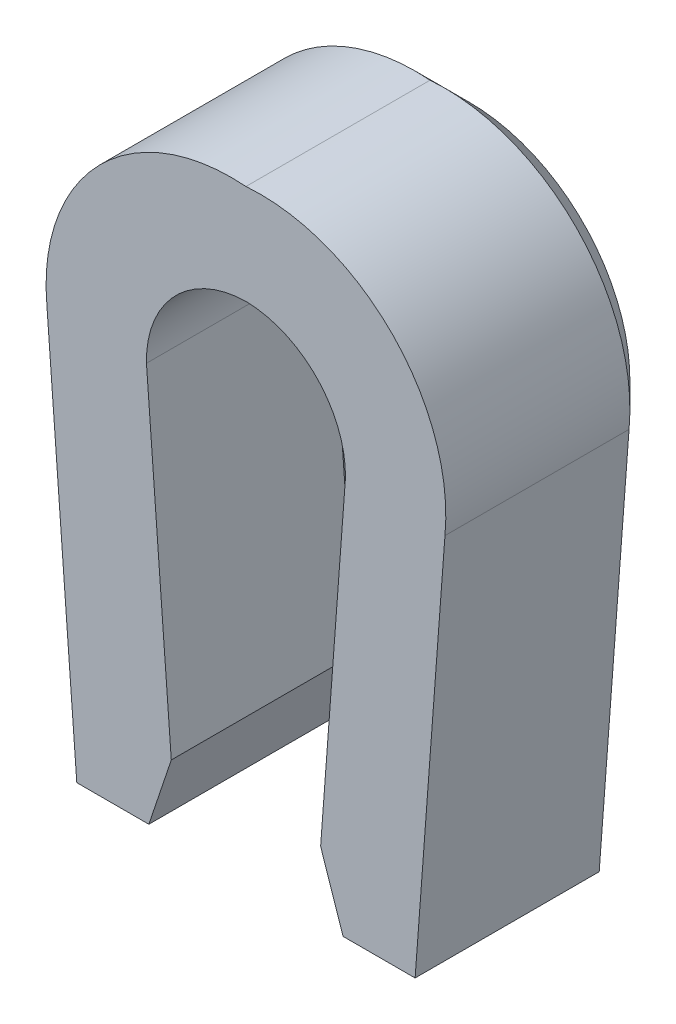
ISO-10303-21;
HEADER;
FILE_DESCRIPTION(('STEP AP214'),'2;1');
FILE_NAME('part.step','',(''),(''),'','','');
FILE_SCHEMA(('AUTOMOTIVE_DESIGN { 1 0 10303 214 1 1 1 1 }'));
ENDSEC;
DATA;
#1=APPLICATION_CONTEXT('core data for automotive mechanical design processes');
#2=APPLICATION_PROTOCOL_DEFINITION('international standard','automotive_design',2000,#1);
#3=PRODUCT_CONTEXT('',#1,'mechanical');
#4=PRODUCT('Part','Part','',(#3));
#5=PRODUCT_RELATED_PRODUCT_CATEGORY('part','',(#4));
#6=PRODUCT_DEFINITION_FORMATION('','',#4);
#7=PRODUCT_DEFINITION_CONTEXT('part definition',#1,'design');
#8=PRODUCT_DEFINITION('design','',#6,#7);
#9=PRODUCT_DEFINITION_SHAPE('','',#8);
#10=(LENGTH_UNIT() NAMED_UNIT(*) SI_UNIT(.MILLI.,.METRE.));
#11=(NAMED_UNIT(*) PLANE_ANGLE_UNIT() SI_UNIT($,.RADIAN.));
#12=(NAMED_UNIT(*) SI_UNIT($,.STERADIAN.) SOLID_ANGLE_UNIT());
#13=UNCERTAINTY_MEASURE_WITH_UNIT(LENGTH_MEASURE(1.E-05),#10,'distance_accuracy_value','');
#14=(GEOMETRIC_REPRESENTATION_CONTEXT(3) GLOBAL_UNCERTAINTY_ASSIGNED_CONTEXT((#13)) GLOBAL_UNIT_ASSIGNED_CONTEXT((#10,
#11,#12)) REPRESENTATION_CONTEXT('',''));
#15=CARTESIAN_POINT('',(0.,0.,0.));
#16=DIRECTION('',(0.,0.,1.));
#17=DIRECTION('',(1.,0.,0.));
#18=AXIS2_PLACEMENT_3D('',#15,#16,#17);
#19=CARTESIAN_POINT('',(2.,4.,4.2));
#20=DIRECTION('',(0.997199309888457,-0.0747899482416341,0.));
#21=DIRECTION('',(0.0747899482416341,0.997199309888457,0.));
#22=AXIS2_PLACEMENT_3D('',#19,#20,#21);
#23=PLANE('',#22);
#24=DIRECTION('',(0.,0.,-1.));
#25=VECTOR('',#24,1.);
#26=CARTESIAN_POINT('',(2.,4.,4.2));
#27=LINE('',#26,#25);
#28=CARTESIAN_POINT('',(2.,4.,4.2));
#29=VERTEX_POINT('',#28);
#30=CARTESIAN_POINT('',(2.,4.,0.5));
#31=VERTEX_POINT('',#30);
#32=EDGE_CURVE('E210',#29,#31,#27,.T.);
#33=ORIENTED_EDGE('',*,*,#32,.T.);
#34=DIRECTION('',(-0.0747899482416341,-0.997199309888457,0.));
#35=VECTOR('',#34,1.);
#36=CARTESIAN_POINT('',(1.50084079562383,-2.65545605834899,0.500000000000001));
#37=LINE('',#36,#35);
#38=CARTESIAN_POINT('',(1.50084079562383,-2.65545605834898,0.5));
#39=VERTEX_POINT('',#38);
#40=EDGE_CURVE('E246',#31,#39,#37,.T.);
#41=ORIENTED_EDGE('',*,*,#40,.T.);
#42=DIRECTION('',(0.,0.,-1.));
#43=VECTOR('',#42,1.);
#44=CARTESIAN_POINT('',(1.50084079562383,-2.65545605834898,4.2));
#45=LINE('',#44,#43);
#46=CARTESIAN_POINT('',(1.50084079562383,-2.65545605834898,4.2));
#47=VERTEX_POINT('',#46);
#48=EDGE_CURVE('E486',#47,#39,#45,.T.);
#49=ORIENTED_EDGE('',*,*,#48,.F.);
#50=DIRECTION('',(-0.0747899482416341,-0.997199309888457,0.));
#51=VECTOR('',#50,1.);
#52=CARTESIAN_POINT('',(2.,4.,4.2));
#53=LINE('',#52,#51);
#54=EDGE_CURVE('E420',#29,#47,#53,.T.);
#55=ORIENTED_EDGE('',*,*,#54,.F.);
#56=EDGE_LOOP('',(#33,#41,#49,#55));
#57=FACE_BOUND('',#56,.T.);
#58=ADVANCED_FACE('F35',(#57),#23,.F.);
#59=CARTESIAN_POINT('',(1.4,-4.,4.2));
#60=DIRECTION('',(0.,1.,0.));
#61=DIRECTION('',(-1.,0.,0.));
#62=AXIS2_PLACEMENT_3D('',#59,#60,#61);
#63=PLANE('',#62);
#64=DIRECTION('',(0.,0.,-1.));
#65=VECTOR('',#64,1.);
#66=CARTESIAN_POINT('',(1.95142804931305,-4.,4.2));
#67=LINE('',#66,#65);
#68=CARTESIAN_POINT('',(1.95142804931305,-4.,4.2));
#69=VERTEX_POINT('',#68);
#70=CARTESIAN_POINT('',(1.95142804931305,-4.,0.5));
#71=VERTEX_POINT('',#70);
#72=EDGE_CURVE('E184',#69,#71,#67,.T.);
#73=ORIENTED_EDGE('',*,*,#72,.T.);
#74=DIRECTION('',(1.,0.,0.));
#75=VECTOR('',#74,1.);
#76=CARTESIAN_POINT('',(3.4,-4.,0.5));
#77=LINE('',#76,#75);
#78=CARTESIAN_POINT('',(3.4,-4.,0.5));
#79=VERTEX_POINT('',#78);
#80=EDGE_CURVE('E250',#71,#79,#77,.T.);
#81=ORIENTED_EDGE('',*,*,#80,.T.);
#82=DIRECTION('',(0.,0.,-1.));
#83=VECTOR('',#82,1.);
#84=CARTESIAN_POINT('',(3.4,-4.,4.2));
#85=LINE('',#84,#83);
#86=CARTESIAN_POINT('',(3.4,-4.,4.2));
#87=VERTEX_POINT('',#86);
#88=EDGE_CURVE('E207',#87,#79,#85,.T.);
#89=ORIENTED_EDGE('',*,*,#88,.F.);
#90=DIRECTION('',(1.,0.,0.));
#91=VECTOR('',#90,1.);
#92=CARTESIAN_POINT('',(1.4,-4.,4.2));
#93=LINE('',#92,#91);
#94=EDGE_CURVE('E478',#69,#87,#93,.T.);
#95=ORIENTED_EDGE('',*,*,#94,.F.);
#96=EDGE_LOOP('',(#73,#81,#89,#95));
#97=FACE_BOUND('',#96,.T.);
#98=ADVANCED_FACE('F377',(#97),#63,.F.);
#99=CARTESIAN_POINT('',(-1.4,-4.,4.2));
#100=DIRECTION('',(0.,1.,0.));
#101=DIRECTION('',(-1.,0.,0.));
#102=AXIS2_PLACEMENT_3D('',#99,#100,#101);
#103=PLANE('',#102);
#104=DIRECTION('',(0.,0.,-1.));
#105=VECTOR('',#104,1.);
#106=CARTESIAN_POINT('',(-3.4,-4.,4.2));
#107=LINE('',#106,#105);
#108=CARTESIAN_POINT('',(-3.4,-4.,4.2));
#109=VERTEX_POINT('',#108);
#110=CARTESIAN_POINT('',(-3.4,-4.,0.5));
#111=VERTEX_POINT('',#110);
#112=EDGE_CURVE('E191',#109,#111,#107,.T.);
#113=ORIENTED_EDGE('',*,*,#112,.T.);
#114=DIRECTION('',(1.,0.,0.));
#115=VECTOR('',#114,1.);
#116=CARTESIAN_POINT('',(-1.95142804931304,-4.,0.5));
#117=LINE('',#116,#115);
#118=CARTESIAN_POINT('',(-1.95142804931304,-4.,0.5));
#119=VERTEX_POINT('',#118);
#120=EDGE_CURVE('E66',#111,#119,#117,.T.);
#121=ORIENTED_EDGE('',*,*,#120,.T.);
#122=DIRECTION('',(0.,0.,-1.));
#123=VECTOR('',#122,1.);
#124=CARTESIAN_POINT('',(-1.95142804931304,-4.,4.2));
#125=LINE('',#124,#123);
#126=CARTESIAN_POINT('',(-1.95142804931304,-4.,4.2));
#127=VERTEX_POINT('',#126);
#128=EDGE_CURVE('E174',#127,#119,#125,.T.);
#129=ORIENTED_EDGE('',*,*,#128,.F.);
#130=DIRECTION('',(1.,0.,0.));
#131=VECTOR('',#130,1.);
#132=CARTESIAN_POINT('',(-1.4,-4.,4.2));
#133=LINE('',#132,#131);
#134=EDGE_CURVE('E183',#109,#127,#133,.T.);
#135=ORIENTED_EDGE('',*,*,#134,.F.);
#136=EDGE_LOOP('',(#113,#121,#129,#135));
#137=FACE_BOUND('',#136,.T.);
#138=ADVANCED_FACE('F383',(#137),#103,.F.);
#139=CARTESIAN_POINT('',(-2.,4.,4.2));
#140=DIRECTION('',(-0.997199309888457,-0.0747899482416344,0.));
#141=DIRECTION('',(0.0747899482416344,-0.997199309888457,0.));
#142=AXIS2_PLACEMENT_3D('',#139,#140,#141);
#143=PLANE('',#142);
#144=DIRECTION('',(0.,0.,-1.));
#145=VECTOR('',#144,1.);
#146=CARTESIAN_POINT('',(-1.50084079562383,-2.65545605834898,4.2));
#147=LINE('',#146,#145);
#148=CARTESIAN_POINT('',(-1.50084079562383,-2.65545605834898,4.2));
#149=VERTEX_POINT('',#148);
#150=CARTESIAN_POINT('',(-1.50084079562383,-2.65545605834898,0.5));
#151=VERTEX_POINT('',#150);
#152=EDGE_CURVE('E166',#149,#151,#147,.T.);
#153=ORIENTED_EDGE('',*,*,#152,.T.);
#154=DIRECTION('',(-0.0747899482416344,0.997199309888457,0.));
#155=VECTOR('',#154,1.);
#156=CARTESIAN_POINT('',(-2.,4.,0.5));
#157=LINE('',#156,#155);
#158=CARTESIAN_POINT('',(-2.,4.,0.5));
#159=VERTEX_POINT('',#158);
#160=EDGE_CURVE('E11',#151,#159,#157,.T.);
#161=ORIENTED_EDGE('',*,*,#160,.T.);
#162=DIRECTION('',(0.,0.,-1.));
#163=VECTOR('',#162,1.);
#164=CARTESIAN_POINT('',(-2.,4.,4.2));
#165=LINE('',#164,#163);
#166=CARTESIAN_POINT('',(-2.,4.,4.2));
#167=VERTEX_POINT('',#166);
#168=EDGE_CURVE('E188',#167,#159,#165,.T.);
#169=ORIENTED_EDGE('',*,*,#168,.F.);
#170=DIRECTION('',(-0.0747899482416344,0.997199309888457,0.));
#171=VECTOR('',#170,1.);
#172=CARTESIAN_POINT('',(-2.,4.,4.2));
#173=LINE('',#172,#171);
#174=EDGE_CURVE('E180',#149,#167,#173,.T.);
#175=ORIENTED_EDGE('',*,*,#174,.F.);
#176=EDGE_LOOP('',(#153,#161,#169,#175));
#177=FACE_BOUND('',#176,.T.);
#178=ADVANCED_FACE('F186',(#177),#143,.F.);
#179=CARTESIAN_POINT('',(0.0360134835005064,4.04110421672633,4.2));
#180=DIRECTION('',(0.,0.,-1.));
#181=DIRECTION('',(-1.,0.,0.));
#182=AXIS2_PLACEMENT_3D('',#179,#180,#181);
#183=PLANE('',#182);
#184=DIRECTION('',(-0.317754359343613,-0.948173068125292,0.));
#185=VECTOR('',#184,1.);
#186=CARTESIAN_POINT('',(-1.95142804931304,-4.,4.2));
#187=LINE('',#186,#185);
#188=EDGE_CURVE('E169',#149,#127,#187,.T.);
#189=ORIENTED_EDGE('',*,*,#188,.F.);
#190=ORIENTED_EDGE('',*,*,#174,.T.);
#191=CARTESIAN_POINT('',(0.0360134835005064,4.04110421672633,4.2));
#192=DIRECTION('',(0.,0.,-1.));
#193=DIRECTION('',(-1.,0.,0.));
#194=AXIS2_PLACEMENT_3D('',#191,#192,#193);
#195=CIRCLE('',#194,2.03642835907099);
#196=CARTESIAN_POINT('',(0.,6.07721410831733,4.2));
#197=VERTEX_POINT('',#196);
#198=EDGE_CURVE('E173',#167,#197,#195,.T.);
#199=ORIENTED_EDGE('',*,*,#198,.T.);
#200=CARTESIAN_POINT('',(-0.0360134835005055,4.04110421672633,4.2));
#201=DIRECTION('',(0.,0.,-1.));
#202=DIRECTION('',(1.,0.,0.));
#203=AXIS2_PLACEMENT_3D('',#200,#201,#202);
#204=CIRCLE('',#203,2.03642835907099);
#205=EDGE_CURVE('E481',#197,#29,#204,.T.);
#206=ORIENTED_EDGE('',*,*,#205,.T.);
#207=ORIENTED_EDGE('',*,*,#54,.T.);
#208=DIRECTION('',(-0.317754359343614,0.948173068125292,0.));
#209=VECTOR('',#208,1.);
#210=CARTESIAN_POINT('',(1.50084079562383,-2.65545605834898,4.2));
#211=LINE('',#210,#209);
#212=EDGE_CURVE('E461',#69,#47,#211,.T.);
#213=ORIENTED_EDGE('',*,*,#212,.F.);
#214=ORIENTED_EDGE('',*,*,#94,.T.);
#215=DIRECTION('',(0.0747899482416344,0.997199309888457,0.));
#216=VECTOR('',#215,1.);
#217=CARTESIAN_POINT('',(3.4,-4.,4.2));
#218=LINE('',#217,#216);
#219=CARTESIAN_POINT('',(4.,4.,4.2));
#220=VERTEX_POINT('',#219);
#221=EDGE_CURVE('E476',#87,#220,#218,.T.);
#222=ORIENTED_EDGE('',*,*,#221,.T.);
#223=CARTESIAN_POINT('',(0.288890432809215,4.35990240757147,4.2));
#224=DIRECTION('',(0.,0.,1.));
#225=DIRECTION('',(1.,0.,0.));
#226=AXIS2_PLACEMENT_3D('',#223,#224,#225);
#227=CIRCLE('',#226,3.72852034494526);
#228=CARTESIAN_POINT('',(0.,8.07721410831733,4.2));
#229=VERTEX_POINT('',#228);
#230=EDGE_CURVE('E454',#220,#229,#227,.T.);
#231=ORIENTED_EDGE('',*,*,#230,.T.);
#232=CARTESIAN_POINT('',(-0.288890432809214,4.35990240757147,4.2));
#233=DIRECTION('',(0.,0.,1.));
#234=DIRECTION('',(-1.,0.,0.));
#235=AXIS2_PLACEMENT_3D('',#232,#233,#234);
#236=CIRCLE('',#235,3.72852034494526);
#237=CARTESIAN_POINT('',(-4.,4.,4.2));
#238=VERTEX_POINT('',#237);
#239=EDGE_CURVE('E472',#229,#238,#236,.T.);
#240=ORIENTED_EDGE('',*,*,#239,.T.);
#241=DIRECTION('',(0.0747899482416345,-0.997199309888457,0.));
#242=VECTOR('',#241,1.);
#243=CARTESIAN_POINT('',(-3.4,-4.,4.2));
#244=LINE('',#243,#242);
#245=EDGE_CURVE('E193',#238,#109,#244,.T.);
#246=ORIENTED_EDGE('',*,*,#245,.T.);
#247=ORIENTED_EDGE('',*,*,#134,.T.);
#248=EDGE_LOOP('',(#189,#190,#199,#206,#207,#213,#214,#222,#231,#240,#246,#247));
#249=FACE_BOUND('',#248,.T.);
#250=ADVANCED_FACE('F178',(#249),#183,.F.);
#251=CARTESIAN_POINT('',(0.0360134835005064,4.04110421672633,0.));
#252=DIRECTION('',(0.,0.,-1.));
#253=DIRECTION('',(-1.,0.,0.));
#254=AXIS2_PLACEMENT_3D('',#251,#252,#253);
#255=PLANE('',#254);
#256=CARTESIAN_POINT('',(-0.0360134835005055,4.04110421672633,0.));
#257=DIRECTION('',(0.,0.,-1.));
#258=DIRECTION('',(-1.,0.,0.));
#259=AXIS2_PLACEMENT_3D('',#256,#257,#258);
#260=CIRCLE('',#259,2.53642835907099);
#261=CARTESIAN_POINT('',(2.49956606898237,3.97549054638771,0.));
#262=VERTEX_POINT('',#261);
#263=CARTESIAN_POINT('',(0.,6.57727689414908,0.));
#264=VERTEX_POINT('',#263);
#265=EDGE_CURVE('E239',#262,#264,#260,.F.);
#266=ORIENTED_EDGE('',*,*,#265,.T.);
#267=CARTESIAN_POINT('',(0.0360134835005064,4.04110421672633,0.));
#268=DIRECTION('',(0.,0.,-1.));
#269=DIRECTION('',(-1.,0.,0.));
#270=AXIS2_PLACEMENT_3D('',#267,#268,#269);
#271=CIRCLE('',#270,2.53642835907099);
#272=CARTESIAN_POINT('',(-2.49956606898237,3.97549054638769,0.));
#273=VERTEX_POINT('',#272);
#274=EDGE_CURVE('E241',#264,#273,#271,.F.);
#275=ORIENTED_EDGE('',*,*,#274,.T.);
#276=DIRECTION('',(0.0747899482416344,-0.997199309888456,0.));
#277=VECTOR('',#276,1.);
#278=CARTESIAN_POINT('',(-1.99944045056806,-2.6928510324698,0.));
#279=LINE('',#278,#277);
#280=CARTESIAN_POINT('',(-2.00698614433308,-2.5922417822695,0.));
#281=VERTEX_POINT('',#280);
#282=EDGE_CURVE('E219',#273,#281,#279,.T.);
#283=ORIENTED_EDGE('',*,*,#282,.T.);
#284=DIRECTION('',(-0.317754359343613,-0.948173068125292,0.));
#285=VECTOR('',#284,1.);
#286=CARTESIAN_POINT('',(0.197826217855967,3.98687708935135,0.));
#287=LINE('',#286,#285);
#288=CARTESIAN_POINT('',(-2.31119656815809,-3.5,0.));
#289=VERTEX_POINT('',#288);
#290=EDGE_CURVE('E221',#281,#289,#287,.T.);
#291=ORIENTED_EDGE('',*,*,#290,.T.);
#292=DIRECTION('',(-1.,0.,0.));
#293=VECTOR('',#292,1.);
#294=CARTESIAN_POINT('',(-3.4,-3.5,0.));
#295=LINE('',#294,#293);
#296=CARTESIAN_POINT('',(-2.93609572199671,-3.5,0.));
#297=VERTEX_POINT('',#296);
#298=EDGE_CURVE('E223',#289,#297,#295,.T.);
#299=ORIENTED_EDGE('',*,*,#298,.T.);
#300=DIRECTION('',(-0.0747899482416345,0.997199309888456,0.));
#301=VECTOR('',#300,1.);
#302=CARTESIAN_POINT('',(-3.50140034505577,4.03739497412082,0.));
#303=LINE('',#302,#301);
#304=CARTESIAN_POINT('',(-3.50182297512132,4.04303004166151,0.));
#305=VERTEX_POINT('',#304);
#306=EDGE_CURVE('E225',#297,#305,#303,.T.);
#307=ORIENTED_EDGE('',*,*,#306,.T.);
#308=CARTESIAN_POINT('',(-0.288890432809214,4.35990240757147,0.));
#309=DIRECTION('',(0.,0.,-1.));
#310=DIRECTION('',(-1.,0.,0.));
#311=AXIS2_PLACEMENT_3D('',#308,#309,#310);
#312=CIRCLE('',#311,3.22852034494526);
#313=CARTESIAN_POINT('',(0.,7.57547170950803,0.));
#314=VERTEX_POINT('',#313);
#315=EDGE_CURVE('E227',#305,#314,#312,.T.);
#316=ORIENTED_EDGE('',*,*,#315,.T.);
#317=CARTESIAN_POINT('',(0.288890432809215,4.35990240757147,0.));
#318=DIRECTION('',(0.,0.,-1.));
#319=DIRECTION('',(-1.,0.,0.));
#320=AXIS2_PLACEMENT_3D('',#317,#318,#319);
#321=CIRCLE('',#320,3.22852034494526);
#322=CARTESIAN_POINT('',(3.50182297512132,4.04303004166154,0.));
#323=VERTEX_POINT('',#322);
#324=EDGE_CURVE('E229',#314,#323,#321,.T.);
#325=ORIENTED_EDGE('',*,*,#324,.T.);
#326=DIRECTION('',(-0.0747899482416344,-0.997199309888456,0.));
#327=VECTOR('',#326,1.);
#328=CARTESIAN_POINT('',(2.90140034505577,-3.96260502587918,0.));
#329=LINE('',#328,#327);
#330=CARTESIAN_POINT('',(2.93609572199671,-3.5,0.));
#331=VERTEX_POINT('',#330);
#332=EDGE_CURVE('E231',#323,#331,#329,.T.);
#333=ORIENTED_EDGE('',*,*,#332,.T.);
#334=DIRECTION('',(-1.,0.,0.));
#335=VECTOR('',#334,1.);
#336=CARTESIAN_POINT('',(1.95142804931305,-3.5,0.));
#337=LINE('',#336,#335);
#338=CARTESIAN_POINT('',(2.31119656815809,-3.5,0.));
#339=VERTEX_POINT('',#338);
#340=EDGE_CURVE('E233',#331,#339,#337,.T.);
#341=ORIENTED_EDGE('',*,*,#340,.T.);
#342=DIRECTION('',(-0.317754359343614,0.948173068125292,0.));
#343=VECTOR('',#342,1.);
#344=CARTESIAN_POINT('',(-0.190553811088825,3.96517636350984,0.));
#345=LINE('',#344,#343);
#346=CARTESIAN_POINT('',(2.00698614433308,-2.59224178226951,0.));
#347=VERTEX_POINT('',#346);
#348=EDGE_CURVE('E235',#339,#347,#345,.T.);
#349=ORIENTED_EDGE('',*,*,#348,.T.);
#350=DIRECTION('',(0.0747899482416341,0.997199309888456,0.));
#351=VECTOR('',#350,1.);
#352=CARTESIAN_POINT('',(2.49859965494423,3.96260502587918,0.));
#353=LINE('',#352,#351);
#354=EDGE_CURVE('E237',#347,#262,#353,.T.);
#355=ORIENTED_EDGE('',*,*,#354,.T.);
#356=EDGE_LOOP('',(#266,#275,#283,#291,#299,#307,#316,#325,#333,#341,#349,#355));
#357=FACE_BOUND('',#356,.T.);
#358=ADVANCED_FACE('F394',(#357),#255,.T.);
#359=CARTESIAN_POINT('',(0.0360134835005064,4.04110421672633,4.2));
#360=DIRECTION('',(0.,0.,-1.));
#361=DIRECTION('',(-1.,0.,0.));
#362=AXIS2_PLACEMENT_3D('',#359,#360,#361);
#363=CYLINDRICAL_SURFACE('',#362,2.03642835907099);
#364=ORIENTED_EDGE('',*,*,#168,.T.);
#365=CARTESIAN_POINT('',(0.0360134835005064,4.04110421672633,0.5));
#366=DIRECTION('',(0.,0.,-1.));
#367=DIRECTION('',(-1.,0.,0.));
#368=AXIS2_PLACEMENT_3D('',#365,#366,#367);
#369=CIRCLE('',#368,2.03642835907099);
#370=CARTESIAN_POINT('',(0.,6.07721410831733,0.5));
#371=VERTEX_POINT('',#370);
#372=EDGE_CURVE('E216',#159,#371,#369,.T.);
#373=ORIENTED_EDGE('',*,*,#372,.T.);
#374=DIRECTION('',(0.,0.,-1.));
#375=VECTOR('',#374,1.);
#376=CARTESIAN_POINT('',(0.,6.07721410831733,4.2));
#377=LINE('',#376,#375);
#378=EDGE_CURVE('E213',#197,#371,#377,.T.);
#379=ORIENTED_EDGE('',*,*,#378,.F.);
#380=ORIENTED_EDGE('',*,*,#198,.F.);
#381=EDGE_LOOP('',(#364,#373,#379,#380));
#382=FACE_BOUND('',#381,.T.);
#383=ADVANCED_FACE('F391',(#382),#363,.F.);
#384=CARTESIAN_POINT('',(-0.0360134835005055,4.04110421672633,4.2));
#385=DIRECTION('',(0.,0.,-1.));
#386=DIRECTION('',(-1.,0.,0.));
#387=AXIS2_PLACEMENT_3D('',#384,#385,#386);
#388=CYLINDRICAL_SURFACE('',#387,2.03642835907099);
#389=ORIENTED_EDGE('',*,*,#378,.T.);
#390=CARTESIAN_POINT('',(-0.0360134835005055,4.04110421672633,0.5));
#391=DIRECTION('',(0.,0.,-1.));
#392=DIRECTION('',(-1.,0.,0.));
#393=AXIS2_PLACEMENT_3D('',#390,#391,#392);
#394=CIRCLE('',#393,2.03642835907099);
#395=EDGE_CURVE('E244',#371,#31,#394,.T.);
#396=ORIENTED_EDGE('',*,*,#395,.T.);
#397=ORIENTED_EDGE('',*,*,#32,.F.);
#398=ORIENTED_EDGE('',*,*,#205,.F.);
#399=EDGE_LOOP('',(#389,#396,#397,#398));
#400=FACE_BOUND('',#399,.T.);
#401=ADVANCED_FACE('F388',(#400),#388,.F.);
#402=CARTESIAN_POINT('',(3.4,-4.,4.2));
#403=DIRECTION('',(-0.997199309888457,0.0747899482416344,0.));
#404=DIRECTION('',(-0.0747899482416344,-0.997199309888457,0.));
#405=AXIS2_PLACEMENT_3D('',#402,#403,#404);
#406=PLANE('',#405);
#407=ORIENTED_EDGE('',*,*,#88,.T.);
#408=DIRECTION('',(0.0747899482416344,0.997199309888457,0.));
#409=VECTOR('',#408,1.);
#410=CARTESIAN_POINT('',(4.,4.,0.500000000000001));
#411=LINE('',#410,#409);
#412=CARTESIAN_POINT('',(4.,4.,0.5));
#413=VERTEX_POINT('',#412);
#414=EDGE_CURVE('E252',#79,#413,#411,.T.);
#415=ORIENTED_EDGE('',*,*,#414,.T.);
#416=DIRECTION('',(0.,0.,-1.));
#417=VECTOR('',#416,1.);
#418=CARTESIAN_POINT('',(4.,4.,4.2));
#419=LINE('',#418,#417);
#420=EDGE_CURVE('E204',#220,#413,#419,.T.);
#421=ORIENTED_EDGE('',*,*,#420,.F.);
#422=ORIENTED_EDGE('',*,*,#221,.F.);
#423=EDGE_LOOP('',(#407,#415,#421,#422));
#424=FACE_BOUND('',#423,.T.);
#425=ADVANCED_FACE('F390',(#424),#406,.F.);
#426=CARTESIAN_POINT('',(0.288890432809215,4.35990240757147,4.2));
#427=DIRECTION('',(0.,0.,-1.));
#428=DIRECTION('',(-1.,0.,0.));
#429=AXIS2_PLACEMENT_3D('',#426,#427,#428);
#430=CYLINDRICAL_SURFACE('',#429,3.72852034494526);
#431=ORIENTED_EDGE('',*,*,#420,.T.);
#432=CARTESIAN_POINT('',(0.288890432809215,4.35990240757147,0.5));
#433=DIRECTION('',(0.,0.,-1.));
#434=DIRECTION('',(-1.,0.,0.));
#435=AXIS2_PLACEMENT_3D('',#432,#433,#434);
#436=CIRCLE('',#435,3.72852034494526);
#437=CARTESIAN_POINT('',(0.,8.07721410831733,0.5));
#438=VERTEX_POINT('',#437);
#439=EDGE_CURVE('E254',#413,#438,#436,.F.);
#440=ORIENTED_EDGE('',*,*,#439,.T.);
#441=DIRECTION('',(0.,0.,-1.));
#442=VECTOR('',#441,1.);
#443=CARTESIAN_POINT('',(0.,8.07721410831733,4.2));
#444=LINE('',#443,#442);
#445=EDGE_CURVE('E201',#229,#438,#444,.T.);
#446=ORIENTED_EDGE('',*,*,#445,.F.);
#447=ORIENTED_EDGE('',*,*,#230,.F.);
#448=EDGE_LOOP('',(#431,#440,#446,#447));
#449=FACE_BOUND('',#448,.T.);
#450=ADVANCED_FACE('F452',(#449),#430,.T.);
#451=CARTESIAN_POINT('',(-0.288890432809214,4.35990240757147,4.2));
#452=DIRECTION('',(0.,0.,-1.));
#453=DIRECTION('',(-1.,0.,0.));
#454=AXIS2_PLACEMENT_3D('',#451,#452,#453);
#455=CYLINDRICAL_SURFACE('',#454,3.72852034494526);
#456=ORIENTED_EDGE('',*,*,#445,.T.);
#457=CARTESIAN_POINT('',(-0.288890432809214,4.35990240757147,0.5));
#458=DIRECTION('',(0.,0.,-1.));
#459=DIRECTION('',(-1.,0.,0.));
#460=AXIS2_PLACEMENT_3D('',#457,#458,#459);
#461=CIRCLE('',#460,3.72852034494526);
#462=CARTESIAN_POINT('',(-4.,4.,0.5));
#463=VERTEX_POINT('',#462);
#464=EDGE_CURVE('E256',#438,#463,#461,.F.);
#465=ORIENTED_EDGE('',*,*,#464,.T.);
#466=DIRECTION('',(0.,0.,-1.));
#467=VECTOR('',#466,1.);
#468=CARTESIAN_POINT('',(-4.,4.,4.2));
#469=LINE('',#468,#467);
#470=EDGE_CURVE('E198',#238,#463,#469,.T.);
#471=ORIENTED_EDGE('',*,*,#470,.F.);
#472=ORIENTED_EDGE('',*,*,#239,.F.);
#473=EDGE_LOOP('',(#456,#465,#471,#472));
#474=FACE_BOUND('',#473,.T.);
#475=ADVANCED_FACE('F466',(#474),#455,.T.);
#476=CARTESIAN_POINT('',(-3.4,-4.,4.2));
#477=DIRECTION('',(0.997199309888457,0.0747899482416345,0.));
#478=DIRECTION('',(-0.0747899482416345,0.997199309888457,0.));
#479=AXIS2_PLACEMENT_3D('',#476,#477,#478);
#480=PLANE('',#479);
#481=ORIENTED_EDGE('',*,*,#470,.T.);
#482=DIRECTION('',(0.0747899482416345,-0.997199309888457,0.));
#483=VECTOR('',#482,1.);
#484=CARTESIAN_POINT('',(-3.4,-4.,0.500000000000001));
#485=LINE('',#484,#483);
#486=EDGE_CURVE('E258',#463,#111,#485,.T.);
#487=ORIENTED_EDGE('',*,*,#486,.T.);
#488=ORIENTED_EDGE('',*,*,#112,.F.);
#489=ORIENTED_EDGE('',*,*,#245,.F.);
#490=EDGE_LOOP('',(#481,#487,#488,#489));
#491=FACE_BOUND('',#490,.T.);
#492=ADVANCED_FACE('F470',(#491),#480,.F.);
#493=CARTESIAN_POINT('',(1.50084079562383,-2.65545605834898,4.2));
#494=DIRECTION('',(-0.948173068125292,-0.317754359343614,0.));
#495=DIRECTION('',(0.317754359343614,-0.948173068125292,0.));
#496=AXIS2_PLACEMENT_3D('',#493,#494,#495);
#497=PLANE('',#496);
#498=ORIENTED_EDGE('',*,*,#48,.T.);
#499=DIRECTION('',(0.317754359343614,-0.948173068125292,0.));
#500=VECTOR('',#499,1.);
#501=CARTESIAN_POINT('',(1.50084079562383,-2.65545605834898,0.5));
#502=LINE('',#501,#500);
#503=EDGE_CURVE('E248',#39,#71,#502,.T.);
#504=ORIENTED_EDGE('',*,*,#503,.T.);
#505=ORIENTED_EDGE('',*,*,#72,.F.);
#506=ORIENTED_EDGE('',*,*,#212,.T.);
#507=EDGE_LOOP('',(#498,#504,#505,#506));
#508=FACE_BOUND('',#507,.T.);
#509=ADVANCED_FACE('F497',(#508),#497,.T.);
#510=CARTESIAN_POINT('',(-1.95142804931304,-4.,4.2));
#511=DIRECTION('',(0.948173068125292,-0.317754359343613,0.));
#512=DIRECTION('',(0.317754359343613,0.948173068125292,0.));
#513=AXIS2_PLACEMENT_3D('',#510,#511,#512);
#514=PLANE('',#513);
#515=ORIENTED_EDGE('',*,*,#128,.T.);
#516=DIRECTION('',(0.317754359343613,0.948173068125292,0.));
#517=VECTOR('',#516,1.);
#518=CARTESIAN_POINT('',(-1.95142804931304,-4.,0.5));
#519=LINE('',#518,#517);
#520=EDGE_CURVE('E51',#119,#151,#519,.T.);
#521=ORIENTED_EDGE('',*,*,#520,.T.);
#522=ORIENTED_EDGE('',*,*,#152,.F.);
#523=ORIENTED_EDGE('',*,*,#188,.T.);
#524=EDGE_LOOP('',(#515,#521,#522,#523));
#525=FACE_BOUND('',#524,.T.);
#526=ADVANCED_FACE('F168',(#525),#514,.T.);
#527=CARTESIAN_POINT('',(0.288890432809215,4.35990240757147,0.5));
#528=DIRECTION('',(0.,0.,1.));
#529=DIRECTION('',(1.,0.,0.));
#530=AXIS2_PLACEMENT_3D('',#527,#528,#529);
#531=CONICAL_SURFACE('',#530,3.72852034494526,0.78539816339745);
#532=CARTESIAN_POINT('',(4.,4.,0.5));
#533=CARTESIAN_POINT('',(3.91696777037647,4.00713789287926,0.416666475281922));
#534=CARTESIAN_POINT('',(3.83393690355317,4.01429267611867,0.333333046318125));
#535=CARTESIAN_POINT('',(3.66787789526026,4.02863602333908,0.166666379651457));
#536=CARTESIAN_POINT('',(3.58484975379068,4.03582458732018,0.083333141948588));
#537=CARTESIAN_POINT('',(3.50182297512133,4.04303004166153,0.));
#538=B_SPLINE_CURVE_WITH_KNOTS('',3,(#532,#533,#534,#535,#536,#537),.UNSPECIFIED.,.F.,.F.,(4,2,
4),(0.,0.353564683422246,0.707129367895145),.UNSPECIFIED.);
#539=EDGE_CURVE('E358',#323,#413,#538,.F.);
#540=ORIENTED_EDGE('',*,*,#539,.F.);
#541=ORIENTED_EDGE('',*,*,#324,.F.);
#542=CARTESIAN_POINT('',(0.,8.07721410831733,0.5));
#543=CARTESIAN_POINT('',(0.,7.99361128244541,0.416645686735276));
#544=CARTESIAN_POINT('',(0.,7.90999800298931,0.333301863483358));
#545=CARTESIAN_POINT('',(0.,7.74275053671959,0.166635196816644));
#546=CARTESIAN_POINT('',(0.,7.65911634990592,0.0833123534018947));
#547=CARTESIAN_POINT('',(0.,7.57547170950803,0.));
#548=B_SPLINE_CURVE_WITH_KNOTS('',3,(#542,#543,#544,#545,#546,#547),.UNSPECIFIED.,.F.,.F.,(4,2,
4),(0.,0.354169959738061,0.708339920277226),.UNSPECIFIED.);
#549=EDGE_CURVE('E41',#438,#314,#548,.T.);
#550=ORIENTED_EDGE('',*,*,#549,.F.);
#551=ORIENTED_EDGE('',*,*,#439,.F.);
#552=EDGE_LOOP('',(#540,#541,#550,#551));
#553=FACE_BOUND('',#552,.T.);
#554=ADVANCED_FACE('F38',(#553),#531,.T.);
#555=CARTESIAN_POINT('',(-0.288890432809214,4.35990240757147,0.5));
#556=DIRECTION('',(0.,0.,1.));
#557=DIRECTION('',(1.,0.,0.));
#558=AXIS2_PLACEMENT_3D('',#555,#556,#557);
#559=CONICAL_SURFACE('',#558,3.72852034494526,0.785398163397449);
#560=ORIENTED_EDGE('',*,*,#549,.T.);
#561=ORIENTED_EDGE('',*,*,#315,.F.);
#562=CARTESIAN_POINT('',(-4.,4.,0.5));
#563=CARTESIAN_POINT('',(-3.91696777037647,4.00713789287926,0.416666475281921));
#564=CARTESIAN_POINT('',(-3.83393690355316,4.01429267611866,0.333333046318123));
#565=CARTESIAN_POINT('',(-3.66787789526026,4.02863602333908,0.166666379651454));
#566=CARTESIAN_POINT('',(-3.58484975379067,4.03582458732019,0.083333141948584));
#567=CARTESIAN_POINT('',(-3.50182297512132,4.04303004166154,0.));
#568=B_SPLINE_CURVE_WITH_KNOTS('',3,(#562,#563,#564,#565,#566,#567),.UNSPECIFIED.,.F.,.F.,(4,2,
4),(0.,0.35356468342225,0.707129367895152),.UNSPECIFIED.);
#569=EDGE_CURVE('E351',#463,#305,#568,.T.);
#570=ORIENTED_EDGE('',*,*,#569,.F.);
#571=ORIENTED_EDGE('',*,*,#464,.F.);
#572=EDGE_LOOP('',(#560,#561,#570,#571));
#573=FACE_BOUND('',#572,.T.);
#574=ADVANCED_FACE('F339',(#573),#559,.T.);
#575=CARTESIAN_POINT('',(3.4,-4.,0.5));
#576=DIRECTION('',(0.705126394216672,-0.0528844795662505,-0.707106781186549));
#577=DIRECTION('',(-0.0747899482416344,-0.997199309888457,0.));
#578=AXIS2_PLACEMENT_3D('',#575,#576,#577);
#579=PLANE('',#578);
#580=ORIENTED_EDGE('',*,*,#539,.T.);
#581=ORIENTED_EDGE('',*,*,#414,.F.);
#582=DIRECTION('',(-0.548545232506781,0.591226744952426,-0.591226744952425));
#583=VECTOR('',#582,1.);
#584=CARTESIAN_POINT('',(3.4,-4.,0.5));
#585=LINE('',#584,#583);
#586=EDGE_CURVE('E359',#331,#79,#585,.F.);
#587=ORIENTED_EDGE('',*,*,#586,.F.);
#588=ORIENTED_EDGE('',*,*,#332,.F.);
#589=EDGE_LOOP('',(#580,#581,#587,#588));
#590=FACE_BOUND('',#589,.T.);
#591=ADVANCED_FACE('F346',(#590),#579,.T.);
#592=CARTESIAN_POINT('',(-3.4,-4.,0.5));
#593=DIRECTION('',(-0.705126394216672,-0.0528844795662506,-0.707106781186548));
#594=DIRECTION('',(-0.0747899482416345,0.997199309888457,0.));
#595=AXIS2_PLACEMENT_3D('',#592,#593,#594);
#596=PLANE('',#595);
#597=ORIENTED_EDGE('',*,*,#569,.T.);
#598=ORIENTED_EDGE('',*,*,#306,.F.);
#599=DIRECTION('',(0.548545232506781,0.591226744952426,-0.591226744952426));
#600=VECTOR('',#599,1.);
#601=CARTESIAN_POINT('',(-2.79819625578816,-3.35137077545169,-0.14862922454831));
#602=LINE('',#601,#600);
#603=EDGE_CURVE('E433',#111,#297,#602,.T.);
#604=ORIENTED_EDGE('',*,*,#603,.F.);
#605=ORIENTED_EDGE('',*,*,#486,.F.);
#606=EDGE_LOOP('',(#597,#598,#604,#605));
#607=FACE_BOUND('',#606,.T.);
#608=ADVANCED_FACE('F337',(#607),#596,.T.);
#609=CARTESIAN_POINT('',(1.4,-4.,0.5));
#610=DIRECTION('',(0.,-0.707106781186547,-0.707106781186548));
#611=DIRECTION('',(-1.,0.,0.));
#612=AXIS2_PLACEMENT_3D('',#609,#610,#611);
#613=PLANE('',#612);
#614=ORIENTED_EDGE('',*,*,#586,.T.);
#615=ORIENTED_EDGE('',*,*,#80,.F.);
#616=DIRECTION('',(-0.453469696669179,-0.630224259372315,0.630224259372313));
#617=VECTOR('',#616,1.);
#618=CARTESIAN_POINT('',(1.83803527153853,-4.1575913008433,0.657591300843302));
#619=LINE('',#618,#617);
#620=EDGE_CURVE('E429',#339,#71,#619,.T.);
#621=ORIENTED_EDGE('',*,*,#620,.F.);
#622=ORIENTED_EDGE('',*,*,#340,.F.);
#623=EDGE_LOOP('',(#614,#615,#621,#622));
#624=FACE_BOUND('',#623,.T.);
#625=ADVANCED_FACE('F331',(#624),#613,.T.);
#626=CARTESIAN_POINT('',(-1.4,-4.,0.5));
#627=DIRECTION('',(0.,-0.707106781186547,-0.707106781186548));
#628=DIRECTION('',(-1.,0.,0.));
#629=AXIS2_PLACEMENT_3D('',#626,#627,#628);
#630=PLANE('',#629);
#631=ORIENTED_EDGE('',*,*,#603,.T.);
#632=ORIENTED_EDGE('',*,*,#298,.F.);
#633=DIRECTION('',(0.453469696669181,-0.630224259372314,0.630224259372313));
#634=VECTOR('',#633,1.);
#635=CARTESIAN_POINT('',(-3.93491091797131,-1.2433901734568,-2.2566098265432));
#636=LINE('',#635,#634);
#637=EDGE_CURVE('E427',#119,#289,#636,.F.);
#638=ORIENTED_EDGE('',*,*,#637,.F.);
#639=ORIENTED_EDGE('',*,*,#120,.F.);
#640=EDGE_LOOP('',(#631,#632,#638,#639));
#641=FACE_BOUND('',#640,.T.);
#642=ADVANCED_FACE('F324',(#641),#630,.T.);
#643=CARTESIAN_POINT('',(-0.190553811088825,3.96517636350984,0.));
#644=DIRECTION('',(0.670459606209847,0.224686262243456,0.707106781186548));
#645=DIRECTION('',(-0.317754359343614,0.948173068125292,0.));
#646=AXIS2_PLACEMENT_3D('',#643,#644,#645);
#647=PLANE('',#646);
#648=ORIENTED_EDGE('',*,*,#620,.T.);
#649=ORIENTED_EDGE('',*,*,#503,.F.);
#650=DIRECTION('',(-0.708620796080461,-0.088502148154325,0.700017097744307));
#651=VECTOR('',#650,1.);
#652=CARTESIAN_POINT('',(1.31475084333931,-2.6786974882057,0.683830546659253));
#653=LINE('',#652,#651);
#654=EDGE_CURVE('E424',#347,#39,#653,.T.);
#655=ORIENTED_EDGE('',*,*,#654,.F.);
#656=ORIENTED_EDGE('',*,*,#348,.F.);
#657=EDGE_LOOP('',(#648,#649,#655,#656));
#658=FACE_BOUND('',#657,.T.);
#659=ADVANCED_FACE('F317',(#658),#647,.F.);
#660=CARTESIAN_POINT('',(0.197826217855967,3.98687708935135,0.));
#661=DIRECTION('',(-0.670459606209847,0.224686262243456,0.707106781186549));
#662=DIRECTION('',(-0.317754359343613,-0.948173068125292,0.));
#663=AXIS2_PLACEMENT_3D('',#660,#661,#662);
#664=PLANE('',#663);
#665=ORIENTED_EDGE('',*,*,#637,.T.);
#666=ORIENTED_EDGE('',*,*,#290,.F.);
#667=DIRECTION('',(0.708620796080462,-0.0885021481543265,0.700017097744307));
#668=VECTOR('',#667,1.);
#669=CARTESIAN_POINT('',(-2.16888366253136,-2.57202183075149,-0.159931844292497));
#670=LINE('',#669,#668);
#671=EDGE_CURVE('E300',#151,#281,#670,.F.);
#672=ORIENTED_EDGE('',*,*,#671,.F.);
#673=ORIENTED_EDGE('',*,*,#520,.F.);
#674=EDGE_LOOP('',(#665,#666,#672,#673));
#675=FACE_BOUND('',#674,.T.);
#676=ADVANCED_FACE('F310',(#675),#664,.F.);
#677=CARTESIAN_POINT('',(2.,4.,0.5));
#678=DIRECTION('',(-0.705126394216672,0.0528844795662503,-0.707106781186549));
#679=DIRECTION('',(0.0747899482416341,0.997199309888457,0.));
#680=AXIS2_PLACEMENT_3D('',#677,#678,#679);
#681=PLANE('',#680);
#682=ORIENTED_EDGE('',*,*,#654,.T.);
#683=ORIENTED_EDGE('',*,*,#40,.F.);
#684=CARTESIAN_POINT('',(2.,4.,0.5));
#685=CARTESIAN_POINT('',(2.08326832124012,3.99603291860252,0.416668189711392));
#686=CARTESIAN_POINT('',(2.16653298875157,3.99200692337841,0.333335616756449));
#687=CARTESIAN_POINT('',(2.33305501174513,3.98383710550122,0.166668950089864));
#688=CARTESIAN_POINT('',(2.41631236722764,3.97969328285461,0.0833348563783061));
#689=CARTESIAN_POINT('',(2.49956606898188,3.97549054638783,4.96505850906004E-13));
#690=B_SPLINE_CURVE_WITH_KNOTS('',3,(#684,#685,#686,#687,#688,#689),.UNSPECIFIED.,.F.,.F.,(4,2,
4),(0.,0.353612472740503,0.707224926063554),.UNSPECIFIED.);
#691=EDGE_CURVE('E293',#262,#31,#690,.F.);
#692=ORIENTED_EDGE('',*,*,#691,.F.);
#693=ORIENTED_EDGE('',*,*,#354,.F.);
#694=EDGE_LOOP('',(#682,#683,#692,#693));
#695=FACE_BOUND('',#694,.T.);
#696=ADVANCED_FACE('F303',(#695),#681,.T.);
#697=CARTESIAN_POINT('',(-2.,4.,0.5));
#698=DIRECTION('',(0.705126394216672,0.0528844795662505,-0.707106781186549));
#699=DIRECTION('',(0.0747899482416344,-0.997199309888457,0.));
#700=AXIS2_PLACEMENT_3D('',#697,#698,#699);
#701=PLANE('',#700);
#702=ORIENTED_EDGE('',*,*,#671,.T.);
#703=ORIENTED_EDGE('',*,*,#282,.F.);
#704=CARTESIAN_POINT('',(-2.49956606898138,3.97549054638777,0.));
#705=CARTESIAN_POINT('',(-2.41631236722721,3.97969328285155,0.0833348563780158));
#706=CARTESIAN_POINT('',(-2.33305501174487,3.98383710549818,0.166668950089737));
#707=CARTESIAN_POINT('',(-2.16653298875185,3.99200692338143,0.333335616756562));
#708=CARTESIAN_POINT('',(-2.08326832124078,3.99603291861159,0.416668189711581));
#709=CARTESIAN_POINT('',(-2.00000000000114,4.00000000001812,0.500000000000223));
#710=B_SPLINE_CURVE_WITH_KNOTS('',3,(#704,#705,#706,#707,#708,#709),.UNSPECIFIED.,.F.,.F.,(4,2,
4),(0.,0.353612453323043,0.707224926063527),.UNSPECIFIED.);
#711=EDGE_CURVE('E270',#159,#273,#710,.F.);
#712=ORIENTED_EDGE('',*,*,#711,.F.);
#713=ORIENTED_EDGE('',*,*,#160,.F.);
#714=EDGE_LOOP('',(#702,#703,#712,#713));
#715=FACE_BOUND('',#714,.T.);
#716=ADVANCED_FACE('F288',(#715),#701,.T.);
#717=CARTESIAN_POINT('',(-0.0360134835005055,4.04110421672633,0.5));
#718=DIRECTION('',(0.,0.,-1.));
#719=DIRECTION('',(-1.,0.,0.));
#720=AXIS2_PLACEMENT_3D('',#717,#718,#719);
#721=CONICAL_SURFACE('',#720,2.03642835907099,0.78539816339745);
#722=ORIENTED_EDGE('',*,*,#691,.T.);
#723=ORIENTED_EDGE('',*,*,#395,.F.);
#724=CARTESIAN_POINT('',(0.,6.07721410831733,0.5));
#725=CARTESIAN_POINT('',(0.,6.16055905020416,0.416667811057694));
#726=CARTESIAN_POINT('',(0.,6.2439034199671,0.33333504991966));
#727=CARTESIAN_POINT('',(0.,6.41059101524435,0.166668383252993));
#728=CARTESIAN_POINT('',(0.,6.49393424075866,0.0833344777243608));
#729=CARTESIAN_POINT('',(0.,6.57727689414908,0.));
#730=B_SPLINE_CURVE_WITH_KNOTS('',3,(#724,#725,#726,#727,#728,#729),.UNSPECIFIED.,.F.,.F.,(4,2,
4),(0.,0.353575589443949,0.707151178884252),.UNSPECIFIED.);
#731=EDGE_CURVE('E262',#264,#371,#730,.F.);
#732=ORIENTED_EDGE('',*,*,#731,.F.);
#733=ORIENTED_EDGE('',*,*,#265,.F.);
#734=EDGE_LOOP('',(#722,#723,#732,#733));
#735=FACE_BOUND('',#734,.T.);
#736=ADVANCED_FACE('F282',(#735),#721,.F.);
#737=CARTESIAN_POINT('',(0.0360134835005064,4.04110421672633,0.5));
#738=DIRECTION('',(0.,0.,-1.));
#739=DIRECTION('',(-1.,0.,0.));
#740=AXIS2_PLACEMENT_3D('',#737,#738,#739);
#741=CONICAL_SURFACE('',#740,2.03642835907099,0.785398163397449);
#742=ORIENTED_EDGE('',*,*,#711,.T.);
#743=ORIENTED_EDGE('',*,*,#274,.F.);
#744=ORIENTED_EDGE('',*,*,#731,.T.);
#745=ORIENTED_EDGE('',*,*,#372,.F.);
#746=EDGE_LOOP('',(#742,#743,#744,#745));
#747=FACE_BOUND('',#746,.T.);
#748=ADVANCED_FACE('F278',(#747),#741,.F.);
#749=CLOSED_SHELL('',(#58,#98,#138,#178,#250,#358,#383,#401,#425,#450,#475,#492,#509,#526,#554,
#574,#591,#608,#625,#642,#659,#676,#696,#716,#736,#748));
#750=MANIFOLD_SOLID_BREP('B2',#749);
#751=ADVANCED_BREP_SHAPE_REPRESENTATION('',(#18,#750),#14);
#752=SHAPE_DEFINITION_REPRESENTATION(#9,#751);
ENDSEC;
END-ISO-10303-21;
